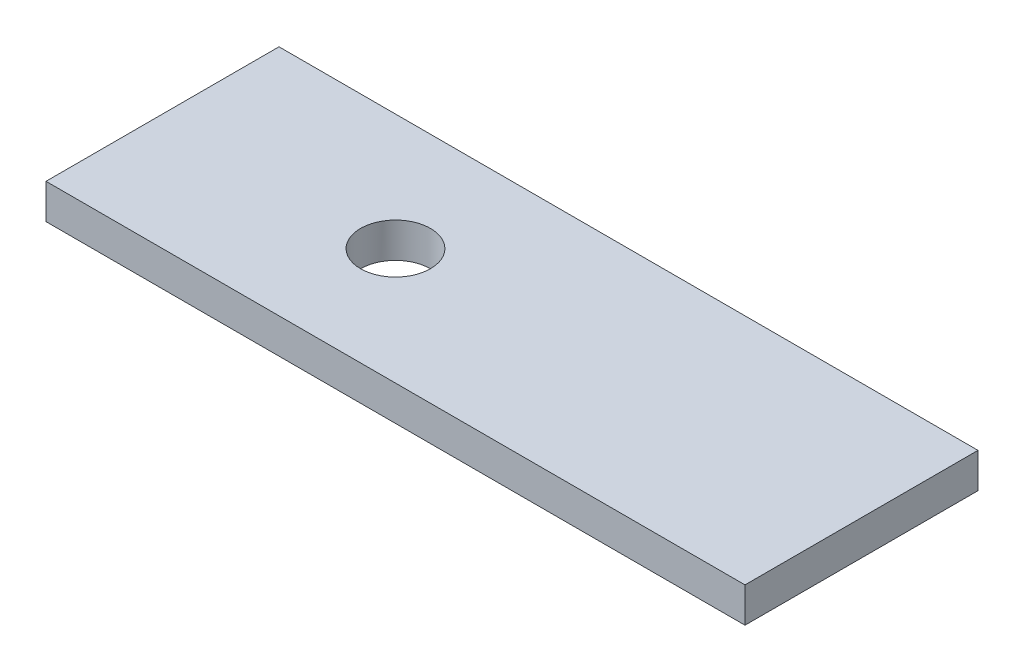
ISO-10303-21;
HEADER;
FILE_DESCRIPTION(('STEP AP214'),'2;1');
FILE_NAME('part.step','',(''),(''),'','','');
FILE_SCHEMA(('AUTOMOTIVE_DESIGN { 1 0 10303 214 1 1 1 1 }'));
ENDSEC;
DATA;
#1=APPLICATION_CONTEXT('core data for automotive mechanical design processes');
#2=APPLICATION_PROTOCOL_DEFINITION('international standard','automotive_design',2000,#1);
#3=PRODUCT_CONTEXT('',#1,'mechanical');
#4=PRODUCT('Part','Part','',(#3));
#5=PRODUCT_RELATED_PRODUCT_CATEGORY('part','',(#4));
#6=PRODUCT_DEFINITION_FORMATION('','',#4);
#7=PRODUCT_DEFINITION_CONTEXT('part definition',#1,'design');
#8=PRODUCT_DEFINITION('design','',#6,#7);
#9=PRODUCT_DEFINITION_SHAPE('','',#8);
#10=(LENGTH_UNIT() NAMED_UNIT(*) SI_UNIT(.MILLI.,.METRE.));
#11=(NAMED_UNIT(*) PLANE_ANGLE_UNIT() SI_UNIT($,.RADIAN.));
#12=(NAMED_UNIT(*) SI_UNIT($,.STERADIAN.) SOLID_ANGLE_UNIT());
#13=UNCERTAINTY_MEASURE_WITH_UNIT(LENGTH_MEASURE(1.E-05),#10,'distance_accuracy_value','');
#14=(GEOMETRIC_REPRESENTATION_CONTEXT(3) GLOBAL_UNCERTAINTY_ASSIGNED_CONTEXT((#13)) GLOBAL_UNIT_ASSIGNED_CONTEXT((#10,
#11,#12)) REPRESENTATION_CONTEXT('',''));
#15=CARTESIAN_POINT('',(0.,0.,0.));
#16=DIRECTION('',(0.,0.,1.));
#17=DIRECTION('',(1.,0.,0.));
#18=AXIS2_PLACEMENT_3D('',#15,#16,#17);
#19=CARTESIAN_POINT('',(0.,-1.5,0.));
#20=DIRECTION('',(-1.,0.,0.));
#21=DIRECTION('',(0.,0.,1.));
#22=AXIS2_PLACEMENT_3D('',#19,#20,#21);
#23=PLANE('',#22);
#24=DIRECTION('',(0.,0.,1.));
#25=VECTOR('',#24,1.);
#26=CARTESIAN_POINT('',(0.,0.,0.));
#27=LINE('',#26,#25);
#28=CARTESIAN_POINT('',(0.,0.,-10.));
#29=VERTEX_POINT('',#28);
#30=CARTESIAN_POINT('',(0.,0.,0.));
#31=VERTEX_POINT('',#30);
#32=EDGE_CURVE('E102',#29,#31,#27,.T.);
#33=ORIENTED_EDGE('',*,*,#32,.F.);
#34=DIRECTION('',(0.,1.,0.));
#35=VECTOR('',#34,1.);
#36=CARTESIAN_POINT('',(0.,-1.5,-10.));
#37=LINE('',#36,#35);
#38=CARTESIAN_POINT('',(0.,-1.5,-10.));
#39=VERTEX_POINT('',#38);
#40=EDGE_CURVE('E11',#39,#29,#37,.T.);
#41=ORIENTED_EDGE('',*,*,#40,.F.);
#42=DIRECTION('',(0.,0.,1.));
#43=VECTOR('',#42,1.);
#44=CARTESIAN_POINT('',(0.,-1.5,0.));
#45=LINE('',#44,#43);
#46=CARTESIAN_POINT('',(0.,-1.5,0.));
#47=VERTEX_POINT('',#46);
#48=EDGE_CURVE('E95',#39,#47,#45,.T.);
#49=ORIENTED_EDGE('',*,*,#48,.T.);
#50=DIRECTION('',(0.,1.,0.));
#51=VECTOR('',#50,1.);
#52=CARTESIAN_POINT('',(0.,-1.5,0.));
#53=LINE('',#52,#51);
#54=EDGE_CURVE('E40',#47,#31,#53,.T.);
#55=ORIENTED_EDGE('',*,*,#54,.T.);
#56=EDGE_LOOP('',(#33,#41,#49,#55));
#57=FACE_BOUND('',#56,.T.);
#58=ADVANCED_FACE('F37',(#57),#23,.T.);
#59=CARTESIAN_POINT('',(0.,-1.5,-10.));
#60=DIRECTION('',(0.,0.,-1.));
#61=DIRECTION('',(-1.,0.,0.));
#62=AXIS2_PLACEMENT_3D('',#59,#60,#61);
#63=PLANE('',#62);
#64=DIRECTION('',(-1.,0.,0.));
#65=VECTOR('',#64,1.);
#66=CARTESIAN_POINT('',(0.,0.,-10.));
#67=LINE('',#66,#65);
#68=CARTESIAN_POINT('',(30.,0.,-10.));
#69=VERTEX_POINT('',#68);
#70=EDGE_CURVE('E97',#69,#29,#67,.T.);
#71=ORIENTED_EDGE('',*,*,#70,.F.);
#72=DIRECTION('',(0.,1.,0.));
#73=VECTOR('',#72,1.);
#74=CARTESIAN_POINT('',(30.,-1.5,-10.));
#75=LINE('',#74,#73);
#76=CARTESIAN_POINT('',(30.,-1.5,-10.));
#77=VERTEX_POINT('',#76);
#78=EDGE_CURVE('E46',#77,#69,#75,.T.);
#79=ORIENTED_EDGE('',*,*,#78,.F.);
#80=DIRECTION('',(-1.,0.,0.));
#81=VECTOR('',#80,1.);
#82=CARTESIAN_POINT('',(0.,-1.5,-10.));
#83=LINE('',#82,#81);
#84=EDGE_CURVE('E92',#77,#39,#83,.T.);
#85=ORIENTED_EDGE('',*,*,#84,.T.);
#86=ORIENTED_EDGE('',*,*,#40,.T.);
#87=EDGE_LOOP('',(#71,#79,#85,#86));
#88=FACE_BOUND('',#87,.T.);
#89=ADVANCED_FACE('F113',(#88),#63,.T.);
#90=CARTESIAN_POINT('',(30.,-1.5,0.));
#91=DIRECTION('',(1.,0.,0.));
#92=DIRECTION('',(0.,0.,-1.));
#93=AXIS2_PLACEMENT_3D('',#90,#91,#92);
#94=PLANE('',#93);
#95=DIRECTION('',(0.,0.,-1.));
#96=VECTOR('',#95,1.);
#97=CARTESIAN_POINT('',(30.,0.,0.));
#98=LINE('',#97,#96);
#99=CARTESIAN_POINT('',(30.,0.,0.));
#100=VERTEX_POINT('',#99);
#101=EDGE_CURVE('E87',#100,#69,#98,.T.);
#102=ORIENTED_EDGE('',*,*,#101,.F.);
#103=DIRECTION('',(0.,1.,0.));
#104=VECTOR('',#103,1.);
#105=CARTESIAN_POINT('',(30.,-1.5,0.));
#106=LINE('',#105,#104);
#107=CARTESIAN_POINT('',(30.,-1.5,0.));
#108=VERTEX_POINT('',#107);
#109=EDGE_CURVE('E82',#108,#100,#106,.T.);
#110=ORIENTED_EDGE('',*,*,#109,.F.);
#111=DIRECTION('',(0.,0.,-1.));
#112=VECTOR('',#111,1.);
#113=CARTESIAN_POINT('',(30.,-1.5,0.));
#114=LINE('',#113,#112);
#115=EDGE_CURVE('E85',#108,#77,#114,.T.);
#116=ORIENTED_EDGE('',*,*,#115,.T.);
#117=ORIENTED_EDGE('',*,*,#78,.T.);
#118=EDGE_LOOP('',(#102,#110,#116,#117));
#119=FACE_BOUND('',#118,.T.);
#120=ADVANCED_FACE('F84',(#119),#94,.T.);
#121=CARTESIAN_POINT('',(0.,-1.5,0.));
#122=DIRECTION('',(0.,0.,1.));
#123=DIRECTION('',(1.,0.,0.));
#124=AXIS2_PLACEMENT_3D('',#121,#122,#123);
#125=PLANE('',#124);
#126=DIRECTION('',(1.,0.,0.));
#127=VECTOR('',#126,1.);
#128=CARTESIAN_POINT('',(0.,0.,0.));
#129=LINE('',#128,#127);
#130=EDGE_CURVE('E105',#31,#100,#129,.T.);
#131=ORIENTED_EDGE('',*,*,#130,.F.);
#132=ORIENTED_EDGE('',*,*,#54,.F.);
#133=DIRECTION('',(1.,0.,0.));
#134=VECTOR('',#133,1.);
#135=CARTESIAN_POINT('',(0.,-1.5,0.));
#136=LINE('',#135,#134);
#137=EDGE_CURVE('E91',#47,#108,#136,.T.);
#138=ORIENTED_EDGE('',*,*,#137,.T.);
#139=ORIENTED_EDGE('',*,*,#109,.T.);
#140=EDGE_LOOP('',(#131,#132,#138,#139));
#141=FACE_BOUND('',#140,.T.);
#142=ADVANCED_FACE('F94',(#141),#125,.T.);
#143=CARTESIAN_POINT('',(0.,-1.5,0.));
#144=DIRECTION('',(0.,-1.,0.));
#145=DIRECTION('',(0.,0.,-1.));
#146=AXIS2_PLACEMENT_3D('',#143,#144,#145);
#147=PLANE('',#146);
#148=CARTESIAN_POINT('',(10.,-1.5,-5.));
#149=DIRECTION('',(0.,-1.,0.));
#150=DIRECTION('',(0.,0.,-1.));
#151=AXIS2_PLACEMENT_3D('',#148,#149,#150);
#152=CIRCLE('',#151,1.5);
#153=CARTESIAN_POINT('',(10.,-1.5,-6.5));
#154=VERTEX_POINT('',#153);
#155=EDGE_CURVE('E106',#154,#154,#152,.T.);
#156=ORIENTED_EDGE('',*,*,#155,.F.);
#157=EDGE_LOOP('',(#156));
#158=FACE_BOUND('',#157,.T.);
#159=ORIENTED_EDGE('',*,*,#48,.F.);
#160=ORIENTED_EDGE('',*,*,#84,.F.);
#161=ORIENTED_EDGE('',*,*,#115,.F.);
#162=ORIENTED_EDGE('',*,*,#137,.F.);
#163=EDGE_LOOP('',(#159,#160,#161,#162));
#164=FACE_BOUND('',#163,.T.);
#165=ADVANCED_FACE('F90',(#158,#164),#147,.T.);
#166=CARTESIAN_POINT('',(0.,0.,0.));
#167=DIRECTION('',(0.,-1.,0.));
#168=DIRECTION('',(0.,0.,-1.));
#169=AXIS2_PLACEMENT_3D('',#166,#167,#168);
#170=PLANE('',#169);
#171=CARTESIAN_POINT('',(10.,0.,-5.));
#172=DIRECTION('',(0.,1.,0.));
#173=DIRECTION('',(0.,0.,1.));
#174=AXIS2_PLACEMENT_3D('',#171,#172,#173);
#175=CIRCLE('',#174,1.5);
#176=CARTESIAN_POINT('',(10.,0.,-3.5));
#177=VERTEX_POINT('',#176);
#178=EDGE_CURVE('E142',#177,#177,#175,.T.);
#179=ORIENTED_EDGE('',*,*,#178,.F.);
#180=EDGE_LOOP('',(#179));
#181=FACE_BOUND('',#180,.T.);
#182=ORIENTED_EDGE('',*,*,#32,.T.);
#183=ORIENTED_EDGE('',*,*,#130,.T.);
#184=ORIENTED_EDGE('',*,*,#101,.T.);
#185=ORIENTED_EDGE('',*,*,#70,.T.);
#186=EDGE_LOOP('',(#182,#183,#184,#185));
#187=FACE_BOUND('',#186,.T.);
#188=ADVANCED_FACE('F112',(#181,#187),#170,.F.);
#189=CARTESIAN_POINT('',(10.,0.,-5.));
#190=DIRECTION('',(0.,1.,0.));
#191=DIRECTION('',(0.,0.,1.));
#192=AXIS2_PLACEMENT_3D('',#189,#190,#191);
#193=CYLINDRICAL_SURFACE('',#192,1.5);
#194=ORIENTED_EDGE('',*,*,#178,.T.);
#195=EDGE_LOOP('',(#194));
#196=FACE_BOUND('',#195,.T.);
#197=ORIENTED_EDGE('',*,*,#155,.T.);
#198=EDGE_LOOP('',(#197));
#199=FACE_BOUND('',#198,.T.);
#200=ADVANCED_FACE('F131',(#196,#199),#193,.F.);
#201=CLOSED_SHELL('',(#58,#89,#120,#142,#165,#188,#200));
#202=MANIFOLD_SOLID_BREP('B2',#201);
#203=ADVANCED_BREP_SHAPE_REPRESENTATION('',(#18,#202),#14);
#204=SHAPE_DEFINITION_REPRESENTATION(#9,#203);
ENDSEC;
END-ISO-10303-21;
